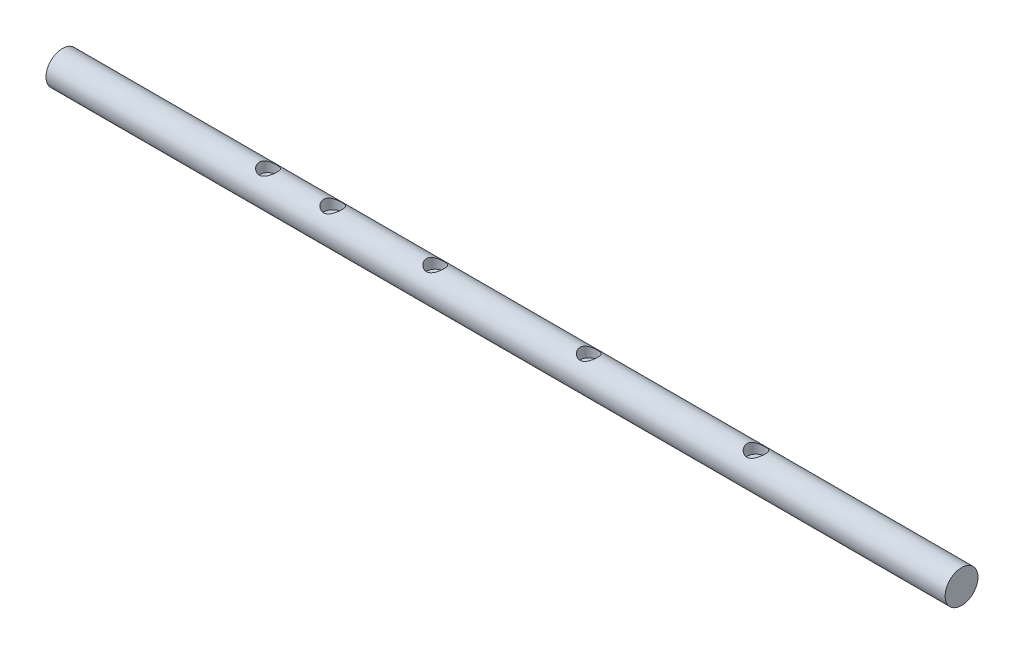
ISO-10303-21;
HEADER;
FILE_DESCRIPTION(('STEP AP214'),'2;1');
FILE_NAME('part.step','',(''),(''),'','','');
FILE_SCHEMA(('AUTOMOTIVE_DESIGN { 1 0 10303 214 1 1 1 1 }'));
ENDSEC;
DATA;
#1=APPLICATION_CONTEXT('core data for automotive mechanical design processes');
#2=APPLICATION_PROTOCOL_DEFINITION('international standard','automotive_design',2000,#1);
#3=PRODUCT_CONTEXT('',#1,'mechanical');
#4=PRODUCT('Part','Part','',(#3));
#5=PRODUCT_RELATED_PRODUCT_CATEGORY('part','',(#4));
#6=PRODUCT_DEFINITION_FORMATION('','',#4);
#7=PRODUCT_DEFINITION_CONTEXT('part definition',#1,'design');
#8=PRODUCT_DEFINITION('design','',#6,#7);
#9=PRODUCT_DEFINITION_SHAPE('','',#8);
#10=(LENGTH_UNIT() NAMED_UNIT(*) SI_UNIT(.MILLI.,.METRE.));
#11=(NAMED_UNIT(*) PLANE_ANGLE_UNIT() SI_UNIT($,.RADIAN.));
#12=(NAMED_UNIT(*) SI_UNIT($,.STERADIAN.) SOLID_ANGLE_UNIT());
#13=UNCERTAINTY_MEASURE_WITH_UNIT(LENGTH_MEASURE(1.E-05),#10,'distance_accuracy_value','');
#14=(GEOMETRIC_REPRESENTATION_CONTEXT(3) GLOBAL_UNCERTAINTY_ASSIGNED_CONTEXT((#13)) GLOBAL_UNIT_ASSIGNED_CONTEXT((#10,
#11,#12)) REPRESENTATION_CONTEXT('',''));
#15=CARTESIAN_POINT('',(0.,0.,0.));
#16=DIRECTION('',(0.,0.,1.));
#17=DIRECTION('',(1.,0.,0.));
#18=AXIS2_PLACEMENT_3D('',#15,#16,#17);
#19=CARTESIAN_POINT('',(-147.615874943087,1.15909090909091,0.));
#20=DIRECTION('',(-1.,0.,0.));
#21=DIRECTION('',(0.,-1.,0.));
#22=AXIS2_PLACEMENT_3D('',#19,#20,#21);
#23=PLANE('',#22);
#24=CARTESIAN_POINT('',(-147.615874943087,1.15909090909091,0.));
#25=DIRECTION('',(-1.,0.,0.));
#26=DIRECTION('',(0.,-1.,0.));
#27=AXIS2_PLACEMENT_3D('',#24,#25,#26);
#28=CIRCLE('',#27,3.);
#29=CARTESIAN_POINT('',(-147.615874943087,-1.84090909090909,0.));
#30=VERTEX_POINT('',#29);
#31=EDGE_CURVE('E95',#30,#30,#28,.T.);
#32=ORIENTED_EDGE('',*,*,#31,.T.);
#33=EDGE_LOOP('',(#32));
#34=FACE_BOUND('',#33,.T.);
#35=ADVANCED_FACE('F32',(#34),#23,.T.);
#36=CARTESIAN_POINT('',(-147.615874943087,1.15909090909091,0.));
#37=DIRECTION('',(-1.,0.,0.));
#38=DIRECTION('',(0.,-1.,0.));
#39=AXIS2_PLACEMENT_3D('',#36,#37,#38);
#40=CYLINDRICAL_SURFACE('',#39,3.);
#41=CARTESIAN_POINT('',(-98.315874943087,3.66458487236442,1.65));
#42=CARTESIAN_POINT('',(-98.2313126989628,3.66459381638236,1.64999358115515));
#43=CARTESIAN_POINT('',(-98.1466765234432,3.66893369213724,1.64345412095509));
#44=CARTESIAN_POINT('',(-97.9801169324309,3.68561396381184,1.61768357796129));
#45=CARTESIAN_POINT('',(-97.8981983353499,3.6979678472243,1.5984310983052));
#46=CARTESIAN_POINT('',(-97.7398167847453,3.72878605333151,1.54839133504122));
#47=CARTESIAN_POINT('',(-97.6633232794472,3.74721219162858,1.51767597794516));
#48=CARTESIAN_POINT('',(-97.5166041937637,3.78803664869795,1.44580368027316));
#49=CARTESIAN_POINT('',(-97.4463799237082,3.8104357949583,1.40464456372702));
#50=CARTESIAN_POINT('',(-97.3063819226009,3.85943318078576,1.30818987552104));
#51=CARTESIAN_POINT('',(-97.2373710861666,3.88622701201934,1.25188597568529));
#52=CARTESIAN_POINT('',(-97.1091595183308,3.9394249303142,1.12882249865068));
#53=CARTESIAN_POINT('',(-97.0499646636413,3.96582877534121,1.06205670422282));
#54=CARTESIAN_POINT('',(-96.938062155562,4.01797346243047,0.912984038802339));
#55=CARTESIAN_POINT('',(-96.8863478539613,4.04346273781419,0.829835009326252));
#56=CARTESIAN_POINT('',(-96.7979970369066,4.0882546837387,0.654349556397898));
#57=CARTESIAN_POINT('',(-96.7613490321912,4.10756206597507,0.562020200659691));
#58=CARTESIAN_POINT('',(-96.7073809582873,4.13638473239481,0.37892285434318));
#59=CARTESIAN_POINT('',(-96.688706799815,4.14658091529646,0.288663762188316));
#60=CARTESIAN_POINT('',(-96.666700164735,4.15862211126619,0.105768848971931));
#61=CARTESIAN_POINT('',(-96.6633560570884,4.16047345561587,0.0131348834272926));
#62=CARTESIAN_POINT('',(-96.6717150668239,4.15588217292798,-0.161456942743374));
#63=CARTESIAN_POINT('',(-96.681879244125,4.15028771497354,-0.243517036042411));
#64=CARTESIAN_POINT('',(-96.7141310824202,4.13279229999728,-0.404548934713674));
#65=CARTESIAN_POINT('',(-96.7362196590609,4.12089085867835,-0.483520502425802));
#66=CARTESIAN_POINT('',(-96.7916925385371,4.09167883042376,-0.637279429786402));
#67=CARTESIAN_POINT('',(-96.8251958943418,4.0743113864664,-0.712012587065488));
#68=CARTESIAN_POINT('',(-96.9023063892292,4.03564512848507,-0.854941741305332));
#69=CARTESIAN_POINT('',(-96.945916760272,4.01434505735336,-0.923135637298112));
#70=CARTESIAN_POINT('',(-97.0473596931285,3.96700905291529,-1.05891717191852));
#71=CARTESIAN_POINT('',(-97.1062188739596,3.94071011081626,-1.12564617195585));
#72=CARTESIAN_POINT('',(-97.2337991485367,3.88764728908871,-1.24879377983835));
#73=CARTESIAN_POINT('',(-97.3025303843454,3.86088295650478,-1.30520164705459));
#74=CARTESIAN_POINT('',(-97.4551728973164,3.8072535165047,-1.41104757147093));
#75=CARTESIAN_POINT('',(-97.5398871180635,3.78058584466619,-1.45943898084593));
#76=CARTESIAN_POINT('',(-97.7179626018427,3.73351760363902,-1.54096072440202));
#77=CARTESIAN_POINT('',(-97.8113137169821,3.71310979815723,-1.57410870202277));
#78=CARTESIAN_POINT('',(-97.996257377001,3.68337959794463,-1.621324807476));
#79=CARTESIAN_POINT('',(-98.0873826502681,3.67329479084845,-1.63671808149072));
#80=CARTESIAN_POINT('',(-98.2714363756915,3.66330223193022,-1.65197600548299));
#81=CARTESIAN_POINT('',(-98.3643626440922,3.66338284237645,-1.65185841284551));
#82=CARTESIAN_POINT('',(-98.5348556398625,3.67290382544872,-1.6373106699758));
#83=CARTESIAN_POINT('',(-98.6126917058751,3.68098209189863,-1.6249632757909));
#84=CARTESIAN_POINT('',(-98.7649697857954,3.70339989225318,-1.58963092545288));
#85=CARTESIAN_POINT('',(-98.8394102942842,3.71774217407268,-1.56664130047229));
#86=CARTESIAN_POINT('',(-98.9864433574276,3.75173791962053,-1.50974087534157));
#87=CARTESIAN_POINT('',(-99.058825763782,3.77158977104944,-1.47541058671726));
#88=CARTESIAN_POINT('',(-99.1972364760699,3.81426616537271,-1.39715088074392));
#89=CARTESIAN_POINT('',(-99.2632616150695,3.83709217668606,-1.35321671440464));
#90=CARTESIAN_POINT('',(-99.39805092592,3.8874783688935,-1.24890384728536));
#91=CARTESIAN_POINT('',(-99.4655915985406,3.91521562119633,-1.18702256034848));
#92=CARTESIAN_POINT('',(-99.5898195776694,3.96930557386378,-1.05259034248068));
#93=CARTESIAN_POINT('',(-99.6465005196929,3.99565745579042,-0.980033198593375));
#94=CARTESIAN_POINT('',(-99.7500585078653,4.04564977083434,-0.821591432017617));
#95=CARTESIAN_POINT('',(-99.7962947508687,4.06908567193977,-0.735218364495383));
#96=CARTESIAN_POINT('',(-99.8730892484628,4.1088931580772,-0.554269536180263));
#97=CARTESIAN_POINT('',(-99.9036638036485,4.12527208513383,-0.459702424085394));
#98=CARTESIAN_POINT('',(-99.9451810614788,4.14771415977066,-0.275417797995459));
#99=CARTESIAN_POINT('',(-99.9578059124313,4.15465796341519,-0.186187129425341));
#100=CARTESIAN_POINT('',(-99.9683068365215,4.16042527767738,-0.00661676308887009));
#101=CARTESIAN_POINT('',(-99.9661906789066,4.15925306584233,0.0837223254250875));
#102=CARTESIAN_POINT('',(-99.9482050146251,4.14940133336615,0.254358366297026));
#103=CARTESIAN_POINT('',(-99.9335812762926,4.1414019558092,0.334831363047828));
#104=CARTESIAN_POINT('',(-99.8929101210965,4.1195379193447,0.491985833876873));
#105=CARTESIAN_POINT('',(-99.8668613411316,4.10567256058449,0.568666854326142));
#106=CARTESIAN_POINT('',(-99.8032623110473,4.07268966094534,0.719080279481085));
#107=CARTESIAN_POINT('',(-99.765349349042,4.05340878850023,0.792622296205394));
#108=CARTESIAN_POINT('',(-99.6795494415993,4.01140741523879,0.932542405269447));
#109=CARTESIAN_POINT('',(-99.6316584624875,3.98868552438746,0.998917583844714));
#110=CARTESIAN_POINT('',(-99.5209489414366,3.93883608034106,1.13072210629174));
#111=CARTESIAN_POINT('',(-99.4570471093613,3.91150236849905,1.19516495605846));
#112=CARTESIAN_POINT('',(-99.3193678055351,3.85732969446146,1.3129044070282));
#113=CARTESIAN_POINT('',(-99.2455784778136,3.83049137093253,1.3661874269137));
#114=CARTESIAN_POINT('',(-99.0841509430355,3.77854198998022,1.46345962344263));
#115=CARTESIAN_POINT('',(-98.9959185444943,3.75366389998695,1.50659692748028));
#116=CARTESIAN_POINT('',(-98.8116961426783,3.71161976493375,1.57680093269355));
#117=CARTESIAN_POINT('',(-98.7157319902588,3.69442918445848,1.60391885150154));
#118=CARTESIAN_POINT('',(-98.5680661600285,3.67676016322301,1.63139486596091));
#119=CARTESIAN_POINT('',(-98.518000178927,3.67222153522233,1.6383544404993));
#120=CARTESIAN_POINT('',(-98.4172566306795,3.66613124145556,1.64765888075615));
#121=CARTESIAN_POINT('',(-98.3665790771178,3.66457950946648,1.65000384878586));
#122=CARTESIAN_POINT('',(-98.315874943087,3.66458487236442,1.65));
#123=B_SPLINE_CURVE_WITH_KNOTS('',3,(#41,#42,#43,#44,#45,#46,#47,#48,#49,#50,#51,#52,#53,#54,
#55,#56,#57,#58,#59,#60,#61,#62,#63,#64,#65,#66,#67,#68,#69,#70,#71,#72,#73,#74,#75,#76,#77,#78,
#79,#80,#81,#82,#83,#84,#85,#86,#87,#88,#89,#90,#91,#92,#93,#94,#95,#96,#97,#98,#99,#100,#101,
#102,#103,#104,#105,#106,#107,#108,#109,#110,#111,#112,#113,#114,#115,#116,#117,#118,#119,#120,
#121,#122),.UNSPECIFIED.,.T.,.F.,(4,2,2,2,2,2,2,2,2,2,2,2,2,2,2,2,2,2,2,2,2,2,2,2,2,2,2,2,2,2,2,
2,2,2,2,2,2,2,2,2,4),(0.,0.253471464978903,0.507370630471961,0.759702723718412,1.01208743389989,
1.28998079678324,1.5680399351238,1.86997289364919,2.17167517502776,2.44828286528195,
2.72468065617498,2.9721366309398,3.21961160997027,3.46975098230537,3.71997045333205,
3.99717687977863,4.27467015892955,4.57652503396567,4.8780296436106,5.15517475627463,
5.43200258623579,5.66859462056208,5.90529054812099,6.15196333618109,6.39875837770523,
6.68465599353131,6.97072065421036,7.27125286686234,7.57147164850534,7.84111747203334,
8.11062118950831,8.35604451303955,8.60149712555499,8.85533990697406,9.10928550569675,
9.39243346006448,9.67592402360688,9.97823556729936,10.2795752459721,10.431561941938,
10.5835452681421),.UNSPECIFIED.);
#124=CARTESIAN_POINT('',(-98.315874943087,3.66458487236442,1.65));
#125=VERTEX_POINT('',#124);
#126=EDGE_CURVE('E10',#125,#125,#123,.T.);
#127=ORIENTED_EDGE('',*,*,#126,.F.);
#128=EDGE_LOOP('',(#127));
#129=FACE_BOUND('',#128,.T.);
#130=CARTESIAN_POINT('',(-79.615874943087,3.69680641718081,1.60000000000001));
#131=CARTESIAN_POINT('',(-79.5334004120163,3.69681484315455,1.59999372902865));
#132=CARTESIAN_POINT('',(-79.4508423778916,3.70088980176129,1.59357932983778));
#133=CARTESIAN_POINT('',(-79.288333308366,3.71656933717782,1.56828258203232));
#134=CARTESIAN_POINT('',(-79.2083872948966,3.72818761403125,1.54937754703877));
#135=CARTESIAN_POINT('',(-79.053770544524,3.75720899302878,1.50019479249204));
#136=CARTESIAN_POINT('',(-78.9790716765058,3.77457784719806,1.46998426801955));
#137=CARTESIAN_POINT('',(-78.8358264819722,3.81308865303088,1.39925451330503));
#138=CARTESIAN_POINT('',(-78.7672811553894,3.83423121624919,1.35873361174392));
#139=CARTESIAN_POINT('',(-78.6311452011762,3.88034207927168,1.26404750373262));
#140=CARTESIAN_POINT('',(-78.5642583438392,3.90548308516633,1.20895416004222));
#141=CARTESIAN_POINT('',(-78.440115053637,3.95537011272434,1.08860845760443));
#142=CARTESIAN_POINT('',(-78.3828640325184,3.98011590541113,1.02335042944417));
#143=CARTESIAN_POINT('',(-78.2751548659302,4.02876687589748,0.878216095721805));
#144=CARTESIAN_POINT('',(-78.2255958625404,4.05244964579449,0.797590815734647));
#145=CARTESIAN_POINT('',(-78.1410708960421,4.09399961079771,0.627645549869461));
#146=CARTESIAN_POINT('',(-78.1060944733274,4.11187097220459,0.538331852815021));
#147=CARTESIAN_POINT('',(-78.0546282362403,4.1385283372725,0.361029029201857));
#148=CARTESIAN_POINT('',(-78.0368945034858,4.14792140135908,0.273494411235123));
#149=CARTESIAN_POINT('',(-78.0162860221023,4.15885818158348,0.0962309461098402));
#150=CARTESIAN_POINT('',(-78.0134008158722,4.16040742199965,0.00650368795729588));
#151=CARTESIAN_POINT('',(-78.0221712353031,4.15573664761598,-0.163099999904361));
#152=CARTESIAN_POINT('',(-78.0324208747601,4.15026778534941,-0.243075222391691));
#153=CARTESIAN_POINT('',(-78.0646052716382,4.13335558606652,-0.39996993582673));
#154=CARTESIAN_POINT('',(-78.0865409170158,4.12191179504897,-0.476889194090897));
#155=CARTESIAN_POINT('',(-78.141528007168,4.09390508181236,-0.626696643763499));
#156=CARTESIAN_POINT('',(-78.174709604033,4.07728241396078,-0.699525429708876));
#157=CARTESIAN_POINT('',(-78.2510199873148,4.04036057711879,-0.838736612142139));
#158=CARTESIAN_POINT('',(-78.2941521115333,4.02006017496206,-0.905116834884368));
#159=CARTESIAN_POINT('',(-78.3942416530496,3.97514908281122,-1.03689401245649));
#160=CARTESIAN_POINT('',(-78.4521682698371,3.95030973394645,-1.10147714320615));
#161=CARTESIAN_POINT('',(-78.5776481019026,3.90036801373344,-1.22048082664393));
#162=CARTESIAN_POINT('',(-78.6452103664501,3.87526541592341,-1.27489171384594));
#163=CARTESIAN_POINT('',(-78.7945277271049,3.82541378157152,-1.37628547852476));
#164=CARTESIAN_POINT('',(-78.8769832800253,3.80085042809025,-1.42233793711389));
#165=CARTESIAN_POINT('',(-79.0500321253066,3.75778289519735,-1.49959087550645));
#166=CARTESIAN_POINT('',(-79.1406160490311,3.73927185145911,-1.53080819917998));
#167=CARTESIAN_POINT('',(-79.3197206709795,3.71262395019241,-1.57482918610285));
#168=CARTESIAN_POINT('',(-79.407812500103,3.70376725958049,-1.58892130462437));
#169=CARTESIAN_POINT('',(-79.5855192822698,3.69544232199523,-1.60218459192319));
#170=CARTESIAN_POINT('',(-79.6751326740444,3.69596497129332,-1.60137022914037));
#171=CARTESIAN_POINT('',(-79.8405968749348,3.70557384090165,-1.5860251531198));
#172=CARTESIAN_POINT('',(-79.9166967833562,3.71351519560281,-1.57332778120756));
#173=CARTESIAN_POINT('',(-80.0654973172755,3.73527735796327,-1.53743313580971));
#174=CARTESIAN_POINT('',(-80.1381965977095,3.74910047059296,-1.51423174573273));
#175=CARTESIAN_POINT('',(-80.2818480344402,3.78176147773997,-1.45695779214086));
#176=CARTESIAN_POINT('',(-80.3525802472291,3.80079434118045,-1.42244930349411));
#177=CARTESIAN_POINT('',(-80.4876717584507,3.84160376315492,-1.34390586859306));
#178=CARTESIAN_POINT('',(-80.5520277902927,3.86338171518055,-1.29986607575595));
#179=CARTESIAN_POINT('',(-80.6824642739247,3.91107226655278,-1.19596121370112));
#180=CARTESIAN_POINT('',(-80.747404461126,3.93712165199486,-1.13472097029285));
#181=CARTESIAN_POINT('',(-80.8665097187619,3.98772644204389,-1.00193372332189));
#182=CARTESIAN_POINT('',(-80.9206694418579,4.0122811010639,-0.93038163505096));
#183=CARTESIAN_POINT('',(-81.0187167186089,4.05840373351447,-0.775115096617066));
#184=CARTESIAN_POINT('',(-81.0620838282533,4.07980517337134,-0.691018771689095));
#185=CARTESIAN_POINT('',(-81.1335990233557,4.11586749024799,-0.515257075494548));
#186=CARTESIAN_POINT('',(-81.1617621629625,4.13053503264777,-0.423599295249487));
#187=CARTESIAN_POINT('',(-81.1993566891144,4.1502759527551,-0.245085247888816));
#188=CARTESIAN_POINT('',(-81.2103647471041,4.15615450869645,-0.158650200440577));
#189=CARTESIAN_POINT('',(-81.2181604464849,4.16030809395629,0.0150269330897061));
#190=CARTESIAN_POINT('',(-81.2149546278647,4.15858662014852,0.102268629586521));
#191=CARTESIAN_POINT('',(-81.1953580126145,4.14818932809119,0.267577989158693));
#192=CARTESIAN_POINT('',(-81.1800579859399,4.14008903176594,0.345815720280643));
#193=CARTESIAN_POINT('',(-81.1383123721854,4.11839799222394,0.498443755728398));
#194=CARTESIAN_POINT('',(-81.1118653740496,4.10480655391189,0.572833571621198));
#195=CARTESIAN_POINT('',(-81.0476068257124,4.07268895595086,0.718851778895751));
#196=CARTESIAN_POINT('',(-81.0094043275804,4.0539960358062,0.790270251834194));
#197=CARTESIAN_POINT('',(-80.9231997388684,4.01349994195644,0.925942643728964));
#198=CARTESIAN_POINT('',(-80.8751934246876,3.99169542896376,0.990193456262654));
#199=CARTESIAN_POINT('',(-80.7646485466711,3.94421542960411,1.11721494450397));
#200=CARTESIAN_POINT('',(-80.7010909902628,3.91837828263939,1.17904014526111));
#201=CARTESIAN_POINT('',(-80.5643837204039,3.86753036387612,1.29157988795468));
#202=CARTESIAN_POINT('',(-80.4912235535187,3.842520530388,1.34228215838384));
#203=CARTESIAN_POINT('',(-80.332417833637,3.79488141752148,1.4336689795462));
#204=CARTESIAN_POINT('',(-80.2463116935073,3.77245329715858,1.47366570008068));
#205=CARTESIAN_POINT('',(-80.067045221997,3.73512859991388,1.53799938953919));
#206=CARTESIAN_POINT('',(-79.9739090962297,3.72020742375259,1.5623875780355));
#207=CARTESIAN_POINT('',(-79.8356269306766,3.70593425133912,1.58544926946728));
#208=CARTESIAN_POINT('',(-79.7919340455311,3.70252830238075,1.59089425785168));
#209=CARTESIAN_POINT('',(-79.7041270704893,3.69796208831815,1.59817136921368));
#210=CARTESIAN_POINT('',(-79.6600129647835,3.69680190783948,1.6000033560454));
#211=CARTESIAN_POINT('',(-79.615874943087,3.69680641718081,1.60000000000001));
#212=B_SPLINE_CURVE_WITH_KNOTS('',3,(#130,#131,#132,#133,#134,#135,#136,#137,#138,#139,#140,
#141,#142,#143,#144,#145,#146,#147,#148,#149,#150,#151,#152,#153,#154,#155,#156,#157,#158,#159,
#160,#161,#162,#163,#164,#165,#166,#167,#168,#169,#170,#171,#172,#173,#174,#175,#176,#177,#178,
#179,#180,#181,#182,#183,#184,#185,#186,#187,#188,#189,#190,#191,#192,#193,#194,#195,#196,#197,
#198,#199,#200,#201,#202,#203,#204,#205,#206,#207,#208,#209,#210,#211),.UNSPECIFIED.,.T.,.F.,(4,
2,2,2,2,2,2,2,2,2,2,2,2,2,2,2,2,2,2,2,2,2,2,2,2,2,2,2,2,2,2,2,2,2,2,2,2,2,2,2,4),(0.,
0.247236947174773,0.494924182632619,0.741162065387772,0.98743988892694,1.25701617256929,
1.52674335596952,1.81786745875614,2.10878238705001,2.37667542174063,2.64437975742192,
2.8856825051537,3.12700359079373,3.37121873440959,3.61551591689507,3.88511401850533,
4.15496699977608,4.44620613475033,4.73711380091718,5.00441947808851,5.27146571838898,
5.50309713228812,5.73481940269526,5.97680341191485,6.21891075815246,6.49665128670814,
6.77452923901577,7.06395553861633,7.35309473588114,7.61364749838935,7.87408038963908,
8.11338489734175,8.35271970686213,8.60107981850486,8.84954715321509,9.12542892067874,
9.40161354419166,9.69269476285079,9.9828158302584,10.1151250220935,10.2474391995364),.UNSPECIFIED.);
#213=CARTESIAN_POINT('',(-79.615874943087,3.69680641718081,1.60000000000001));
#214=VERTEX_POINT('',#213);
#215=EDGE_CURVE('E41',#214,#214,#212,.T.);
#216=ORIENTED_EDGE('',*,*,#215,.F.);
#217=EDGE_LOOP('',(#216));
#218=FACE_BOUND('',#217,.T.);
#219=CARTESIAN_POINT('',(-51.615874943087,3.69680641718081,1.60000000000001));
#220=CARTESIAN_POINT('',(-51.5334004120163,3.69681484315454,1.59999372902865));
#221=CARTESIAN_POINT('',(-51.4508423778916,3.70088980176129,1.59357932983778));
#222=CARTESIAN_POINT('',(-51.288333308366,3.71656933717781,1.56828258203232));
#223=CARTESIAN_POINT('',(-51.2083872948966,3.72818761403125,1.54937754703877));
#224=CARTESIAN_POINT('',(-51.053770544524,3.75720899302878,1.50019479249204));
#225=CARTESIAN_POINT('',(-50.9790716765058,3.77457784719805,1.46998426801956));
#226=CARTESIAN_POINT('',(-50.8358264819722,3.81308865303088,1.39925451330503));
#227=CARTESIAN_POINT('',(-50.7672811553894,3.83423121624919,1.35873361174391));
#228=CARTESIAN_POINT('',(-50.6311452011762,3.88034207927168,1.26404750373262));
#229=CARTESIAN_POINT('',(-50.5642583438392,3.90548308516634,1.20895416004222));
#230=CARTESIAN_POINT('',(-50.440115053637,3.95537011272434,1.08860845760443));
#231=CARTESIAN_POINT('',(-50.3828640325184,3.98011590541113,1.02335042944416));
#232=CARTESIAN_POINT('',(-50.2751548659302,4.02876687589748,0.8782160957218));
#233=CARTESIAN_POINT('',(-50.2255958625404,4.05244964579449,0.797590815734646));
#234=CARTESIAN_POINT('',(-50.1410708960421,4.09399961079771,0.627645549869465));
#235=CARTESIAN_POINT('',(-50.1060944733274,4.11187097220459,0.538331852815024));
#236=CARTESIAN_POINT('',(-50.0546282362403,4.1385283372725,0.361029029201859));
#237=CARTESIAN_POINT('',(-50.0368945034858,4.14792140135908,0.273494411235127));
#238=CARTESIAN_POINT('',(-50.0162860221023,4.15885818158348,0.0962309461098427));
#239=CARTESIAN_POINT('',(-50.0134008158722,4.16040742199965,0.00650368795729647));
#240=CARTESIAN_POINT('',(-50.0221712353031,4.15573664761598,-0.163099999904363));
#241=CARTESIAN_POINT('',(-50.0324208747601,4.15026778534941,-0.243075222391693));
#242=CARTESIAN_POINT('',(-50.0646052716382,4.13335558606652,-0.399969935826732));
#243=CARTESIAN_POINT('',(-50.0865409170158,4.12191179504897,-0.4768891940909));
#244=CARTESIAN_POINT('',(-50.141528007168,4.09390508181236,-0.626696643763501));
#245=CARTESIAN_POINT('',(-50.174709604033,4.07728241396078,-0.699525429708876));
#246=CARTESIAN_POINT('',(-50.2510199873148,4.04036057711879,-0.838736612142139));
#247=CARTESIAN_POINT('',(-50.2941521115333,4.02006017496206,-0.905116834884369));
#248=CARTESIAN_POINT('',(-50.3942416530496,3.97514908281122,-1.03689401245649));
#249=CARTESIAN_POINT('',(-50.4521682698371,3.95030973394644,-1.10147714320616));
#250=CARTESIAN_POINT('',(-50.5776481019026,3.90036801373344,-1.22048082664394));
#251=CARTESIAN_POINT('',(-50.6452103664501,3.8752654159234,-1.27489171384595));
#252=CARTESIAN_POINT('',(-50.7945277271049,3.82541378157152,-1.37628547852477));
#253=CARTESIAN_POINT('',(-50.8769832800253,3.80085042809025,-1.42233793711389));
#254=CARTESIAN_POINT('',(-51.0500321253066,3.75778289519735,-1.49959087550646));
#255=CARTESIAN_POINT('',(-51.1406160490311,3.73927185145911,-1.53080819917998));
#256=CARTESIAN_POINT('',(-51.3197206709795,3.71262395019241,-1.57482918610285));
#257=CARTESIAN_POINT('',(-51.407812500103,3.70376725958049,-1.58892130462437));
#258=CARTESIAN_POINT('',(-51.5855192822698,3.69544232199523,-1.60218459192319));
#259=CARTESIAN_POINT('',(-51.6751326740444,3.69596497129332,-1.60137022914037));
#260=CARTESIAN_POINT('',(-51.8405968749348,3.70557384090166,-1.5860251531198));
#261=CARTESIAN_POINT('',(-51.9166967833563,3.71351519560282,-1.57332778120756));
#262=CARTESIAN_POINT('',(-52.0654973172755,3.73527735796328,-1.53743313580971));
#263=CARTESIAN_POINT('',(-52.1381965977095,3.74910047059297,-1.51423174573273));
#264=CARTESIAN_POINT('',(-52.2818480344402,3.78176147773998,-1.45695779214085));
#265=CARTESIAN_POINT('',(-52.3525802472291,3.80079434118046,-1.4224493034941));
#266=CARTESIAN_POINT('',(-52.4876717584507,3.84160376315493,-1.34390586859305));
#267=CARTESIAN_POINT('',(-52.5520277902927,3.86338171518056,-1.29986607575594));
#268=CARTESIAN_POINT('',(-52.6824642739247,3.91107226655278,-1.19596121370111));
#269=CARTESIAN_POINT('',(-52.747404461126,3.93712165199486,-1.13472097029284));
#270=CARTESIAN_POINT('',(-52.8665097187619,3.98772644204389,-1.00193372332187));
#271=CARTESIAN_POINT('',(-52.9206694418579,4.0122811010639,-0.930381635050949));
#272=CARTESIAN_POINT('',(-53.0187167186089,4.05840373351448,-0.775115096617058));
#273=CARTESIAN_POINT('',(-53.0620838282533,4.07980517337135,-0.691018771689088));
#274=CARTESIAN_POINT('',(-53.1335990233557,4.11586749024799,-0.515257075494546));
#275=CARTESIAN_POINT('',(-53.1617621629625,4.13053503264777,-0.423599295249487));
#276=CARTESIAN_POINT('',(-53.1993566891144,4.1502759527551,-0.245085247888818));
#277=CARTESIAN_POINT('',(-53.2103647471041,4.15615450869645,-0.158650200440579));
#278=CARTESIAN_POINT('',(-53.2181604464849,4.16030809395629,0.0150269330897041));
#279=CARTESIAN_POINT('',(-53.2149546278647,4.15858662014852,0.102268629586519));
#280=CARTESIAN_POINT('',(-53.1953580126145,4.14818932809119,0.267577989158691));
#281=CARTESIAN_POINT('',(-53.1800579859399,4.14008903176594,0.345815720280641));
#282=CARTESIAN_POINT('',(-53.1383123721854,4.11839799222394,0.498443755728397));
#283=CARTESIAN_POINT('',(-53.1118653740496,4.10480655391189,0.572833571621198));
#284=CARTESIAN_POINT('',(-53.0476068257124,4.07268895595086,0.718851778895752));
#285=CARTESIAN_POINT('',(-53.0094043275804,4.0539960358062,0.790270251834193));
#286=CARTESIAN_POINT('',(-52.9231997388684,4.01349994195644,0.925942643728963));
#287=CARTESIAN_POINT('',(-52.8751934246876,3.99169542896376,0.990193456262655));
#288=CARTESIAN_POINT('',(-52.7646485466711,3.94421542960411,1.11721494450397));
#289=CARTESIAN_POINT('',(-52.7010909902628,3.91837828263939,1.1790401452611));
#290=CARTESIAN_POINT('',(-52.5643837204039,3.86753036387613,1.29157988795468));
#291=CARTESIAN_POINT('',(-52.4912235535187,3.842520530388,1.34228215838383));
#292=CARTESIAN_POINT('',(-52.332417833637,3.79488141752148,1.4336689795462));
#293=CARTESIAN_POINT('',(-52.2463116935073,3.77245329715858,1.47366570008068));
#294=CARTESIAN_POINT('',(-52.067045221997,3.73512859991388,1.53799938953919));
#295=CARTESIAN_POINT('',(-51.9739090962297,3.72020742375259,1.56238757803551));
#296=CARTESIAN_POINT('',(-51.8356269306766,3.70593425133912,1.58544926946728));
#297=CARTESIAN_POINT('',(-51.7919340455311,3.70252830238075,1.59089425785168));
#298=CARTESIAN_POINT('',(-51.7041270704893,3.69796208831815,1.59817136921368));
#299=CARTESIAN_POINT('',(-51.6600129647835,3.69680190783948,1.6000033560454));
#300=CARTESIAN_POINT('',(-51.615874943087,3.69680641718081,1.60000000000001));
#301=B_SPLINE_CURVE_WITH_KNOTS('',3,(#219,#220,#221,#222,#223,#224,#225,#226,#227,#228,#229,
#230,#231,#232,#233,#234,#235,#236,#237,#238,#239,#240,#241,#242,#243,#244,#245,#246,#247,#248,
#249,#250,#251,#252,#253,#254,#255,#256,#257,#258,#259,#260,#261,#262,#263,#264,#265,#266,#267,
#268,#269,#270,#271,#272,#273,#274,#275,#276,#277,#278,#279,#280,#281,#282,#283,#284,#285,#286,
#287,#288,#289,#290,#291,#292,#293,#294,#295,#296,#297,#298,#299,#300),.UNSPECIFIED.,.T.,.F.,(4,
2,2,2,2,2,2,2,2,2,2,2,2,2,2,2,2,2,2,2,2,2,2,2,2,2,2,2,2,2,2,2,2,2,2,2,2,2,2,2,4),(0.,
0.247236947174773,0.494924182632619,0.741162065387765,0.987439888926948,1.2570161725693,
1.52674335596953,1.81786745875614,2.10878238705,2.37667542174063,2.64437975742193,
2.8856825051537,3.12700359079373,3.37121873440959,3.61551591689507,3.88511401850534,
4.15496699977609,4.44620613475035,4.7371138009172,5.00441947808851,5.27146571838899,
5.50309713228814,5.73481940269527,5.97680341191487,6.21891075815248,6.49665128670816,
6.77452923901578,7.06395553861633,7.35309473588114,7.61364749838935,7.87408038963908,
8.11338489734174,8.35271970686213,8.60107981850486,8.84954715321508,9.12542892067873,
9.40161354419165,9.6926947628508,9.9828158302584,10.1151250220935,10.2474391995364),.UNSPECIFIED.);
#302=CARTESIAN_POINT('',(-51.615874943087,3.69680641718081,1.60000000000001));
#303=VERTEX_POINT('',#302);
#304=EDGE_CURVE('E45',#303,#303,#301,.T.);
#305=ORIENTED_EDGE('',*,*,#304,.F.);
#306=EDGE_LOOP('',(#305));
#307=FACE_BOUND('',#306,.T.);
#308=CARTESIAN_POINT('',(-21.115874943087,3.66458487236442,1.65));
#309=CARTESIAN_POINT('',(-21.0313126989628,3.66459381638236,1.64999358115515));
#310=CARTESIAN_POINT('',(-20.9466765234432,3.66893369213724,1.64345412095509));
#311=CARTESIAN_POINT('',(-20.7801169324309,3.68561396381184,1.61768357796129));
#312=CARTESIAN_POINT('',(-20.6981983353499,3.6979678472243,1.5984310983052));
#313=CARTESIAN_POINT('',(-20.5398167847453,3.72878605333151,1.54839133504122));
#314=CARTESIAN_POINT('',(-20.4633232794472,3.74721219162858,1.51767597794516));
#315=CARTESIAN_POINT('',(-20.3166041937637,3.78803664869795,1.44580368027317));
#316=CARTESIAN_POINT('',(-20.2463799237082,3.8104357949583,1.40464456372703));
#317=CARTESIAN_POINT('',(-20.1063819226009,3.85943318078576,1.30818987552104));
#318=CARTESIAN_POINT('',(-20.0373710861666,3.88622701201934,1.25188597568529));
#319=CARTESIAN_POINT('',(-19.9091595183308,3.9394249303142,1.12882249865069));
#320=CARTESIAN_POINT('',(-19.8499646636413,3.96582877534121,1.06205670422283));
#321=CARTESIAN_POINT('',(-19.738062155562,4.01797346243047,0.912984038802348));
#322=CARTESIAN_POINT('',(-19.6863478539613,4.04346273781419,0.829835009326258));
#323=CARTESIAN_POINT('',(-19.5979970369066,4.0882546837387,0.654349556397898));
#324=CARTESIAN_POINT('',(-19.5613490321912,4.10756206597507,0.562020200659689));
#325=CARTESIAN_POINT('',(-19.5073809582873,4.13638473239481,0.378922854343176));
#326=CARTESIAN_POINT('',(-19.488706799815,4.14658091529646,0.288663762188313));
#327=CARTESIAN_POINT('',(-19.466700164735,4.15862211126619,0.105768848971929));
#328=CARTESIAN_POINT('',(-19.4633560570884,4.16047345561587,0.0131348834272919));
#329=CARTESIAN_POINT('',(-19.4717150668239,4.15588217292798,-0.161456942743374));
#330=CARTESIAN_POINT('',(-19.481879244125,4.15028771497354,-0.243517036042412));
#331=CARTESIAN_POINT('',(-19.5141310824202,4.13279229999728,-0.404548934713675));
#332=CARTESIAN_POINT('',(-19.5362196590609,4.12089085867835,-0.483520502425803));
#333=CARTESIAN_POINT('',(-19.5916925385371,4.09167883042376,-0.637279429786403));
#334=CARTESIAN_POINT('',(-19.6251958943419,4.0743113864664,-0.712012587065489));
#335=CARTESIAN_POINT('',(-19.7023063892292,4.03564512848507,-0.854941741305335));
#336=CARTESIAN_POINT('',(-19.745916760272,4.01434505735335,-0.923135637298117));
#337=CARTESIAN_POINT('',(-19.8473596931285,3.96700905291529,-1.05891717191853));
#338=CARTESIAN_POINT('',(-19.9062188739596,3.94071011081626,-1.12564617195585));
#339=CARTESIAN_POINT('',(-20.0337991485367,3.88764728908871,-1.24879377983835));
#340=CARTESIAN_POINT('',(-20.1025303843454,3.86088295650478,-1.30520164705459));
#341=CARTESIAN_POINT('',(-20.2551728973164,3.8072535165047,-1.41104757147093));
#342=CARTESIAN_POINT('',(-20.3398871180635,3.78058584466619,-1.45943898084593));
#343=CARTESIAN_POINT('',(-20.5179626018427,3.73351760363902,-1.54096072440202));
#344=CARTESIAN_POINT('',(-20.6113137169821,3.71310979815723,-1.57410870202277));
#345=CARTESIAN_POINT('',(-20.796257377001,3.68337959794463,-1.621324807476));
#346=CARTESIAN_POINT('',(-20.8873826502681,3.67329479084845,-1.63671808149072));
#347=CARTESIAN_POINT('',(-21.0714363756915,3.66330223193022,-1.651976005483));
#348=CARTESIAN_POINT('',(-21.1643626440922,3.66338284237645,-1.65185841284551));
#349=CARTESIAN_POINT('',(-21.3348556398625,3.67290382544872,-1.63731066997579));
#350=CARTESIAN_POINT('',(-21.4126917058752,3.68098209189863,-1.6249632757909));
#351=CARTESIAN_POINT('',(-21.5649697857954,3.70339989225318,-1.58963092545288));
#352=CARTESIAN_POINT('',(-21.6394102942842,3.71774217407268,-1.56664130047228));
#353=CARTESIAN_POINT('',(-21.7864433574277,3.75173791962053,-1.50974087534156));
#354=CARTESIAN_POINT('',(-21.858825763782,3.77158977104944,-1.47541058671725));
#355=CARTESIAN_POINT('',(-21.99723647607,3.81426616537271,-1.39715088074391));
#356=CARTESIAN_POINT('',(-22.0632616150696,3.83709217668606,-1.35321671440464));
#357=CARTESIAN_POINT('',(-22.19805092592,3.8874783688935,-1.24890384728535));
#358=CARTESIAN_POINT('',(-22.2655915985406,3.91521562119633,-1.18702256034848));
#359=CARTESIAN_POINT('',(-22.3898195776694,3.96930557386378,-1.05259034248068));
#360=CARTESIAN_POINT('',(-22.4465005196929,3.99565745579042,-0.980033198593378));
#361=CARTESIAN_POINT('',(-22.5500585078653,4.04564977083434,-0.821591432017624));
#362=CARTESIAN_POINT('',(-22.5962947508687,4.06908567193976,-0.735218364495389));
#363=CARTESIAN_POINT('',(-22.6730892484628,4.1088931580772,-0.554269536180265));
#364=CARTESIAN_POINT('',(-22.7036638036485,4.12527208513383,-0.459702424085395));
#365=CARTESIAN_POINT('',(-22.7451810614788,4.14771415977066,-0.275417797995458));
#366=CARTESIAN_POINT('',(-22.7578059124313,4.15465796341519,-0.18618712942534));
#367=CARTESIAN_POINT('',(-22.7683068365215,4.16042527767738,-0.00661676308886744));
#368=CARTESIAN_POINT('',(-22.7661906789066,4.15925306584233,0.0837223254250907));
#369=CARTESIAN_POINT('',(-22.7482050146251,4.14940133336615,0.254358366297029));
#370=CARTESIAN_POINT('',(-22.7335812762926,4.1414019558092,0.33483136304783));
#371=CARTESIAN_POINT('',(-22.6929101210965,4.1195379193447,0.491985833876875));
#372=CARTESIAN_POINT('',(-22.6668613411316,4.10567256058449,0.568666854326145));
#373=CARTESIAN_POINT('',(-22.6032623110474,4.07268966094534,0.719080279481091));
#374=CARTESIAN_POINT('',(-22.5653493490419,4.05340878850023,0.792622296205401));
#375=CARTESIAN_POINT('',(-22.4795494415993,4.01140741523879,0.932542405269453));
#376=CARTESIAN_POINT('',(-22.4316584624875,3.98868552438746,0.998917583844718));
#377=CARTESIAN_POINT('',(-22.3209489414366,3.93883608034106,1.13072210629174));
#378=CARTESIAN_POINT('',(-22.2570471093613,3.91150236849905,1.19516495605846));
#379=CARTESIAN_POINT('',(-22.1193678055351,3.85732969446145,1.31290440702821));
#380=CARTESIAN_POINT('',(-22.0455784778136,3.83049137093253,1.36618742691371));
#381=CARTESIAN_POINT('',(-21.8841509430355,3.77854198998022,1.46345962344263));
#382=CARTESIAN_POINT('',(-21.7959185444943,3.75366389998695,1.50659692748028));
#383=CARTESIAN_POINT('',(-21.6116961426783,3.71161976493375,1.57680093269355));
#384=CARTESIAN_POINT('',(-21.5157319902588,3.69442918445848,1.60391885150154));
#385=CARTESIAN_POINT('',(-21.3680661600285,3.67676016322301,1.63139486596091));
#386=CARTESIAN_POINT('',(-21.318000178927,3.67222153522233,1.6383544404993));
#387=CARTESIAN_POINT('',(-21.2172566306795,3.66613124145556,1.64765888075615));
#388=CARTESIAN_POINT('',(-21.1665790771178,3.66457950946648,1.65000384878586));
#389=CARTESIAN_POINT('',(-21.115874943087,3.66458487236442,1.65));
#390=B_SPLINE_CURVE_WITH_KNOTS('',3,(#308,#309,#310,#311,#312,#313,#314,#315,#316,#317,#318,
#319,#320,#321,#322,#323,#324,#325,#326,#327,#328,#329,#330,#331,#332,#333,#334,#335,#336,#337,
#338,#339,#340,#341,#342,#343,#344,#345,#346,#347,#348,#349,#350,#351,#352,#353,#354,#355,#356,
#357,#358,#359,#360,#361,#362,#363,#364,#365,#366,#367,#368,#369,#370,#371,#372,#373,#374,#375,
#376,#377,#378,#379,#380,#381,#382,#383,#384,#385,#386,#387,#388,#389),.UNSPECIFIED.,.T.,.F.,(4,
2,2,2,2,2,2,2,2,2,2,2,2,2,2,2,2,2,2,2,2,2,2,2,2,2,2,2,2,2,2,2,2,2,2,2,2,2,2,2,4),(0.,
0.25347146497891,0.507370630471961,0.75970272371841,1.0120874338999,1.28998079678324,
1.56803993512379,1.86997289364919,2.17167517502776,2.44828286528195,2.72468065617498,
2.9721366309398,3.21961160997027,3.46975098230538,3.71997045333205,3.99717687977864,
4.27467015892956,4.57652503396566,4.87802964361061,5.15517475627462,5.43200258623579,
5.66859462056209,5.905290548121,6.15196333618109,6.39875837770524,6.68465599353131,
6.97072065421035,7.27125286686233,7.57147164850534,7.84111747203334,8.11062118950831,
8.35604451303955,8.60149712555499,8.85533990697407,9.10928550569676,9.39243346006449,
9.67592402360689,9.97823556729935,10.2795752459721,10.431561941938,10.5835452681421),.UNSPECIFIED.);
#391=CARTESIAN_POINT('',(-21.115874943087,3.66458487236442,1.65));
#392=VERTEX_POINT('',#391);
#393=EDGE_CURVE('E49',#392,#392,#390,.T.);
#394=ORIENTED_EDGE('',*,*,#393,.F.);
#395=EDGE_LOOP('',(#394));
#396=FACE_BOUND('',#395,.T.);
#397=CARTESIAN_POINT('',(-110.115874943087,3.69680641718081,1.60000000000001));
#398=CARTESIAN_POINT('',(-110.033400412016,3.69681484315455,1.59999372902865));
#399=CARTESIAN_POINT('',(-109.950842377892,3.7008898017613,1.59357932983778));
#400=CARTESIAN_POINT('',(-109.788333308366,3.71656933717782,1.56828258203232));
#401=CARTESIAN_POINT('',(-109.708387294897,3.72818761403125,1.54937754703877));
#402=CARTESIAN_POINT('',(-109.553770544524,3.75720899302878,1.50019479249203));
#403=CARTESIAN_POINT('',(-109.479071676506,3.77457784719806,1.46998426801955));
#404=CARTESIAN_POINT('',(-109.335826481972,3.81308865303089,1.39925451330503));
#405=CARTESIAN_POINT('',(-109.267281155389,3.83423121624919,1.35873361174391));
#406=CARTESIAN_POINT('',(-109.131145201176,3.88034207927168,1.26404750373262));
#407=CARTESIAN_POINT('',(-109.064258343839,3.90548308516634,1.20895416004222));
#408=CARTESIAN_POINT('',(-108.940115053637,3.95537011272434,1.08860845760443));
#409=CARTESIAN_POINT('',(-108.882864032518,3.98011590541113,1.02335042944417));
#410=CARTESIAN_POINT('',(-108.77515486593,4.02876687589749,0.878216095721802));
#411=CARTESIAN_POINT('',(-108.72559586254,4.05244964579449,0.797590815734643));
#412=CARTESIAN_POINT('',(-108.641070896042,4.09399961079771,0.627645549869458));
#413=CARTESIAN_POINT('',(-108.606094473327,4.11187097220459,0.538331852815017));
#414=CARTESIAN_POINT('',(-108.55462823624,4.1385283372725,0.361029029201853));
#415=CARTESIAN_POINT('',(-108.536894503486,4.14792140135908,0.27349441123512));
#416=CARTESIAN_POINT('',(-108.516286022102,4.15885818158348,0.0962309461098368));
#417=CARTESIAN_POINT('',(-108.513400815872,4.16040742199965,0.00650368795729256));
#418=CARTESIAN_POINT('',(-108.522171235303,4.15573664761598,-0.163099999904365));
#419=CARTESIAN_POINT('',(-108.53242087476,4.15026778534941,-0.243075222391695));
#420=CARTESIAN_POINT('',(-108.564605271638,4.13335558606652,-0.399969935826733));
#421=CARTESIAN_POINT('',(-108.586540917016,4.12191179504897,-0.476889194090901));
#422=CARTESIAN_POINT('',(-108.641528007168,4.09390508181236,-0.626696643763503));
#423=CARTESIAN_POINT('',(-108.674709604033,4.07728241396078,-0.69952542970888));
#424=CARTESIAN_POINT('',(-108.751019987315,4.04036057711879,-0.838736612142143));
#425=CARTESIAN_POINT('',(-108.794152111533,4.02006017496206,-0.905116834884371));
#426=CARTESIAN_POINT('',(-108.89424165305,3.97514908281122,-1.0368940124565));
#427=CARTESIAN_POINT('',(-108.952168269837,3.95030973394644,-1.10147714320616));
#428=CARTESIAN_POINT('',(-109.077648101903,3.90036801373344,-1.22048082664394));
#429=CARTESIAN_POINT('',(-109.14521036645,3.8752654159234,-1.27489171384595));
#430=CARTESIAN_POINT('',(-109.294527727105,3.82541378157152,-1.37628547852477));
#431=CARTESIAN_POINT('',(-109.376983280025,3.80085042809025,-1.42233793711389));
#432=CARTESIAN_POINT('',(-109.550032125307,3.75778289519735,-1.49959087550646));
#433=CARTESIAN_POINT('',(-109.640616049031,3.73927185145911,-1.53080819917998));
#434=CARTESIAN_POINT('',(-109.819720670979,3.71262395019241,-1.57482918610286));
#435=CARTESIAN_POINT('',(-109.907812500103,3.70376725958049,-1.58892130462437));
#436=CARTESIAN_POINT('',(-110.08551928227,3.69544232199523,-1.60218459192319));
#437=CARTESIAN_POINT('',(-110.175132674044,3.69596497129332,-1.60137022914038));
#438=CARTESIAN_POINT('',(-110.340596874935,3.70557384090165,-1.58602515311981));
#439=CARTESIAN_POINT('',(-110.416696783356,3.71351519560281,-1.57332778120756));
#440=CARTESIAN_POINT('',(-110.565497317276,3.73527735796327,-1.53743313580971));
#441=CARTESIAN_POINT('',(-110.63819659771,3.74910047059296,-1.51423174573273));
#442=CARTESIAN_POINT('',(-110.78184803444,3.78176147773997,-1.45695779214086));
#443=CARTESIAN_POINT('',(-110.852580247229,3.80079434118045,-1.42244930349411));
#444=CARTESIAN_POINT('',(-110.987671758451,3.84160376315492,-1.34390586859306));
#445=CARTESIAN_POINT('',(-111.052027790293,3.86338171518055,-1.29986607575595));
#446=CARTESIAN_POINT('',(-111.182464273925,3.91107226655278,-1.19596121370112));
#447=CARTESIAN_POINT('',(-111.247404461126,3.93712165199485,-1.13472097029286));
#448=CARTESIAN_POINT('',(-111.366509718762,3.98772644204388,-1.00193372332189));
#449=CARTESIAN_POINT('',(-111.420669441858,4.0122811010639,-0.930381635050963));
#450=CARTESIAN_POINT('',(-111.518716718609,4.05840373351447,-0.775115096617069));
#451=CARTESIAN_POINT('',(-111.562083828253,4.07980517337134,-0.691018771689098));
#452=CARTESIAN_POINT('',(-111.633599023356,4.11586749024799,-0.515257075494552));
#453=CARTESIAN_POINT('',(-111.661762162962,4.13053503264777,-0.42359929524949));
#454=CARTESIAN_POINT('',(-111.699356689114,4.1502759527551,-0.24508524788882));
#455=CARTESIAN_POINT('',(-111.710364747104,4.15615450869645,-0.158650200440582));
#456=CARTESIAN_POINT('',(-111.718160446485,4.16030809395629,0.0150269330897002));
#457=CARTESIAN_POINT('',(-111.714954627865,4.15858662014852,0.102268629586515));
#458=CARTESIAN_POINT('',(-111.695358012614,4.14818932809119,0.267577989158688));
#459=CARTESIAN_POINT('',(-111.68005798594,4.14008903176594,0.345815720280639));
#460=CARTESIAN_POINT('',(-111.638312372185,4.11839799222394,0.498443755728395));
#461=CARTESIAN_POINT('',(-111.61186537405,4.10480655391189,0.572833571621194));
#462=CARTESIAN_POINT('',(-111.547606825712,4.07268895595086,0.718851778895748));
#463=CARTESIAN_POINT('',(-111.50940432758,4.0539960358062,0.790270251834191));
#464=CARTESIAN_POINT('',(-111.423199738868,4.01349994195644,0.925942643728961));
#465=CARTESIAN_POINT('',(-111.375193424688,3.99169542896376,0.990193456262651));
#466=CARTESIAN_POINT('',(-111.264648546671,3.94421542960411,1.11721494450397));
#467=CARTESIAN_POINT('',(-111.201090990263,3.91837828263939,1.17904014526111));
#468=CARTESIAN_POINT('',(-111.064383720404,3.86753036387613,1.29157988795468));
#469=CARTESIAN_POINT('',(-110.991223553519,3.842520530388,1.34228215838383));
#470=CARTESIAN_POINT('',(-110.832417833637,3.79488141752148,1.4336689795462));
#471=CARTESIAN_POINT('',(-110.746311693507,3.77245329715858,1.47366570008068));
#472=CARTESIAN_POINT('',(-110.567045221997,3.73512859991388,1.53799938953919));
#473=CARTESIAN_POINT('',(-110.47390909623,3.72020742375259,1.5623875780355));
#474=CARTESIAN_POINT('',(-110.335626930677,3.70593425133912,1.58544926946728));
#475=CARTESIAN_POINT('',(-110.291934045531,3.70252830238075,1.59089425785168));
#476=CARTESIAN_POINT('',(-110.204127070489,3.69796208831815,1.59817136921368));
#477=CARTESIAN_POINT('',(-110.160012964784,3.69680190783948,1.6000033560454));
#478=CARTESIAN_POINT('',(-110.115874943087,3.69680641718081,1.60000000000001));
#479=B_SPLINE_CURVE_WITH_KNOTS('',3,(#397,#398,#399,#400,#401,#402,#403,#404,#405,#406,#407,
#408,#409,#410,#411,#412,#413,#414,#415,#416,#417,#418,#419,#420,#421,#422,#423,#424,#425,#426,
#427,#428,#429,#430,#431,#432,#433,#434,#435,#436,#437,#438,#439,#440,#441,#442,#443,#444,#445,
#446,#447,#448,#449,#450,#451,#452,#453,#454,#455,#456,#457,#458,#459,#460,#461,#462,#463,#464,
#465,#466,#467,#468,#469,#470,#471,#472,#473,#474,#475,#476,#477,#478),.UNSPECIFIED.,.T.,.F.,(4,
2,2,2,2,2,2,2,2,2,2,2,2,2,2,2,2,2,2,2,2,2,2,2,2,2,2,2,2,2,2,2,2,2,2,2,2,2,2,2,4),(0.,
0.247236947174773,0.494924182632618,0.741162065387772,0.98743988892694,1.25701617256929,
1.52674335596952,1.81786745875614,2.10878238705001,2.37667542174063,2.64437975742192,
2.8856825051537,3.12700359079373,3.37121873440959,3.61551591689507,3.88511401850535,
4.15496699977608,4.44620613475034,4.73711380091718,5.00441947808851,5.27146571838898,
5.50309713228813,5.73481940269527,5.97680341191485,6.21891075815246,6.49665128670814,
6.77452923901577,7.06395553861633,7.35309473588114,7.61364749838935,7.87408038963908,
8.11338489734175,8.35271970686213,8.60107981850486,8.84954715321509,9.12542892067874,
9.40161354419166,9.69269476285081,9.9828158302584,10.1151250220935,10.2474391995364),.UNSPECIFIED.);
#480=CARTESIAN_POINT('',(-110.115874943087,3.69680641718081,1.60000000000001));
#481=VERTEX_POINT('',#480);
#482=EDGE_CURVE('E90',#481,#481,#479,.T.);
#483=ORIENTED_EDGE('',*,*,#482,.F.);
#484=EDGE_LOOP('',(#483));
#485=FACE_BOUND('',#484,.T.);
#486=CARTESIAN_POINT('',(16.384125056913,1.15909090909091,0.));
#487=DIRECTION('',(-1.,0.,0.));
#488=DIRECTION('',(0.,-1.,0.));
#489=AXIS2_PLACEMENT_3D('',#486,#487,#488);
#490=CIRCLE('',#489,3.);
#491=CARTESIAN_POINT('',(16.384125056913,-1.84090909090909,0.));
#492=VERTEX_POINT('',#491);
#493=EDGE_CURVE('E116',#492,#492,#490,.T.);
#494=ORIENTED_EDGE('',*,*,#493,.T.);
#495=EDGE_LOOP('',(#494));
#496=FACE_BOUND('',#495,.T.);
#497=ORIENTED_EDGE('',*,*,#31,.F.);
#498=EDGE_LOOP('',(#497));
#499=FACE_BOUND('',#498,.T.);
#500=ADVANCED_FACE('F58',(#129,#218,#307,#396,#485,#496,#499),#40,.T.);
#501=CARTESIAN_POINT('',(16.384125056913,1.15909090909091,0.));
#502=DIRECTION('',(1.,0.,0.));
#503=DIRECTION('',(0.,1.,0.));
#504=AXIS2_PLACEMENT_3D('',#501,#502,#503);
#505=PLANE('',#504);
#506=ORIENTED_EDGE('',*,*,#493,.F.);
#507=EDGE_LOOP('',(#506));
#508=FACE_BOUND('',#507,.T.);
#509=ADVANCED_FACE('F100',(#508),#505,.T.);
#510=CARTESIAN_POINT('',(-110.115874943087,2.15909090909091,0.));
#511=DIRECTION('',(0.,1.,0.));
#512=DIRECTION('',(0.,0.,1.));
#513=AXIS2_PLACEMENT_3D('',#510,#511,#512);
#514=CYLINDRICAL_SURFACE('',#513,1.60000000000001);
#515=ORIENTED_EDGE('',*,*,#482,.T.);
#516=EDGE_LOOP('',(#515));
#517=FACE_BOUND('',#516,.T.);
#518=CARTESIAN_POINT('',(-110.115874943087,2.15909090909091,0.));
#519=DIRECTION('',(0.,1.,0.));
#520=DIRECTION('',(0.,0.,1.));
#521=AXIS2_PLACEMENT_3D('',#518,#519,#520);
#522=CIRCLE('',#521,1.60000000000001);
#523=CARTESIAN_POINT('',(-110.115874943087,2.15909090909091,1.60000000000001));
#524=VERTEX_POINT('',#523);
#525=EDGE_CURVE('E118',#524,#524,#522,.T.);
#526=ORIENTED_EDGE('',*,*,#525,.F.);
#527=EDGE_LOOP('',(#526));
#528=FACE_BOUND('',#527,.T.);
#529=ADVANCED_FACE('F97',(#517,#528),#514,.F.);
#530=CARTESIAN_POINT('',(0.,2.15909090909091,0.));
#531=DIRECTION('',(0.,1.,0.));
#532=DIRECTION('',(0.,0.,1.));
#533=AXIS2_PLACEMENT_3D('',#530,#531,#532);
#534=PLANE('',#533);
#535=ORIENTED_EDGE('',*,*,#525,.T.);
#536=EDGE_LOOP('',(#535));
#537=FACE_BOUND('',#536,.T.);
#538=ADVANCED_FACE('F83',(#537),#534,.T.);
#539=CARTESIAN_POINT('',(-21.115874943087,2.15909090909091,0.));
#540=DIRECTION('',(0.,1.,0.));
#541=DIRECTION('',(0.,0.,1.));
#542=AXIS2_PLACEMENT_3D('',#539,#540,#541);
#543=CYLINDRICAL_SURFACE('',#542,1.65);
#544=ORIENTED_EDGE('',*,*,#393,.T.);
#545=EDGE_LOOP('',(#544));
#546=FACE_BOUND('',#545,.T.);
#547=CARTESIAN_POINT('',(-21.115874943087,2.15909090909091,0.));
#548=DIRECTION('',(0.,1.,0.));
#549=DIRECTION('',(0.,0.,1.));
#550=AXIS2_PLACEMENT_3D('',#547,#548,#549);
#551=CIRCLE('',#550,1.65);
#552=CARTESIAN_POINT('',(-21.115874943087,2.15909090909091,1.65));
#553=VERTEX_POINT('',#552);
#554=EDGE_CURVE('E124',#553,#553,#551,.T.);
#555=ORIENTED_EDGE('',*,*,#554,.F.);
#556=EDGE_LOOP('',(#555));
#557=FACE_BOUND('',#556,.T.);
#558=ADVANCED_FACE('F78',(#546,#557),#543,.F.);
#559=CARTESIAN_POINT('',(0.,2.15909090909091,0.));
#560=DIRECTION('',(0.,1.,0.));
#561=DIRECTION('',(0.,0.,1.));
#562=AXIS2_PLACEMENT_3D('',#559,#560,#561);
#563=PLANE('',#562);
#564=ORIENTED_EDGE('',*,*,#554,.T.);
#565=EDGE_LOOP('',(#564));
#566=FACE_BOUND('',#565,.T.);
#567=ADVANCED_FACE('F74',(#566),#563,.T.);
#568=CARTESIAN_POINT('',(-51.615874943087,2.15909090909091,0.));
#569=DIRECTION('',(0.,1.,0.));
#570=DIRECTION('',(0.,0.,1.));
#571=AXIS2_PLACEMENT_3D('',#568,#569,#570);
#572=CYLINDRICAL_SURFACE('',#571,1.60000000000001);
#573=ORIENTED_EDGE('',*,*,#304,.T.);
#574=EDGE_LOOP('',(#573));
#575=FACE_BOUND('',#574,.T.);
#576=CARTESIAN_POINT('',(-51.615874943087,2.15909090909091,0.));
#577=DIRECTION('',(0.,1.,0.));
#578=DIRECTION('',(0.,0.,1.));
#579=AXIS2_PLACEMENT_3D('',#576,#577,#578);
#580=CIRCLE('',#579,1.60000000000001);
#581=CARTESIAN_POINT('',(-51.615874943087,2.15909090909091,1.60000000000001));
#582=VERTEX_POINT('',#581);
#583=EDGE_CURVE('E127',#582,#582,#580,.T.);
#584=ORIENTED_EDGE('',*,*,#583,.F.);
#585=EDGE_LOOP('',(#584));
#586=FACE_BOUND('',#585,.T.);
#587=ADVANCED_FACE('F69',(#575,#586),#572,.F.);
#588=CARTESIAN_POINT('',(0.,2.15909090909091,0.));
#589=DIRECTION('',(0.,1.,0.));
#590=DIRECTION('',(0.,0.,1.));
#591=AXIS2_PLACEMENT_3D('',#588,#589,#590);
#592=PLANE('',#591);
#593=ORIENTED_EDGE('',*,*,#583,.T.);
#594=EDGE_LOOP('',(#593));
#595=FACE_BOUND('',#594,.T.);
#596=ADVANCED_FACE('F67',(#595),#592,.T.);
#597=CARTESIAN_POINT('',(-79.615874943087,2.15909090909091,0.));
#598=DIRECTION('',(0.,1.,0.));
#599=DIRECTION('',(0.,0.,1.));
#600=AXIS2_PLACEMENT_3D('',#597,#598,#599);
#601=CYLINDRICAL_SURFACE('',#600,1.60000000000001);
#602=ORIENTED_EDGE('',*,*,#215,.T.);
#603=EDGE_LOOP('',(#602));
#604=FACE_BOUND('',#603,.T.);
#605=CARTESIAN_POINT('',(-79.615874943087,2.15909090909091,0.));
#606=DIRECTION('',(0.,1.,0.));
#607=DIRECTION('',(0.,0.,1.));
#608=AXIS2_PLACEMENT_3D('',#605,#606,#607);
#609=CIRCLE('',#608,1.60000000000001);
#610=CARTESIAN_POINT('',(-79.615874943087,2.15909090909091,1.60000000000001));
#611=VERTEX_POINT('',#610);
#612=EDGE_CURVE('E130',#611,#611,#609,.T.);
#613=ORIENTED_EDGE('',*,*,#612,.F.);
#614=EDGE_LOOP('',(#613));
#615=FACE_BOUND('',#614,.T.);
#616=ADVANCED_FACE('F61',(#604,#615),#601,.F.);
#617=CARTESIAN_POINT('',(0.,2.15909090909091,0.));
#618=DIRECTION('',(0.,1.,0.));
#619=DIRECTION('',(0.,0.,1.));
#620=AXIS2_PLACEMENT_3D('',#617,#618,#619);
#621=PLANE('',#620);
#622=ORIENTED_EDGE('',*,*,#612,.T.);
#623=EDGE_LOOP('',(#622));
#624=FACE_BOUND('',#623,.T.);
#625=ADVANCED_FACE('F66',(#624),#621,.T.);
#626=CARTESIAN_POINT('',(-98.315874943087,2.15909090909091,0.));
#627=DIRECTION('',(0.,1.,0.));
#628=DIRECTION('',(0.,0.,1.));
#629=AXIS2_PLACEMENT_3D('',#626,#627,#628);
#630=CYLINDRICAL_SURFACE('',#629,1.65);
#631=ORIENTED_EDGE('',*,*,#126,.T.);
#632=EDGE_LOOP('',(#631));
#633=FACE_BOUND('',#632,.T.);
#634=CARTESIAN_POINT('',(-98.315874943087,2.15909090909091,0.));
#635=DIRECTION('',(0.,1.,0.));
#636=DIRECTION('',(0.,0.,1.));
#637=AXIS2_PLACEMENT_3D('',#634,#635,#636);
#638=CIRCLE('',#637,1.65);
#639=CARTESIAN_POINT('',(-98.315874943087,2.15909090909091,1.65));
#640=VERTEX_POINT('',#639);
#641=EDGE_CURVE('E121',#640,#640,#638,.T.);
#642=ORIENTED_EDGE('',*,*,#641,.F.);
#643=EDGE_LOOP('',(#642));
#644=FACE_BOUND('',#643,.T.);
#645=ADVANCED_FACE('F138',(#633,#644),#630,.F.);
#646=CARTESIAN_POINT('',(0.,2.15909090909091,0.));
#647=DIRECTION('',(0.,1.,0.));
#648=DIRECTION('',(0.,0.,1.));
#649=AXIS2_PLACEMENT_3D('',#646,#647,#648);
#650=PLANE('',#649);
#651=ORIENTED_EDGE('',*,*,#641,.T.);
#652=EDGE_LOOP('',(#651));
#653=FACE_BOUND('',#652,.T.);
#654=ADVANCED_FACE('F136',(#653),#650,.T.);
#655=CLOSED_SHELL('',(#35,#500,#509,#529,#538,#558,#567,#587,#596,#616,#625,#645,#654));
#656=MANIFOLD_SOLID_BREP('B2',#655);
#657=ADVANCED_BREP_SHAPE_REPRESENTATION('',(#18,#656),#14);
#658=SHAPE_DEFINITION_REPRESENTATION(#9,#657);
ENDSEC;
END-ISO-10303-21;
